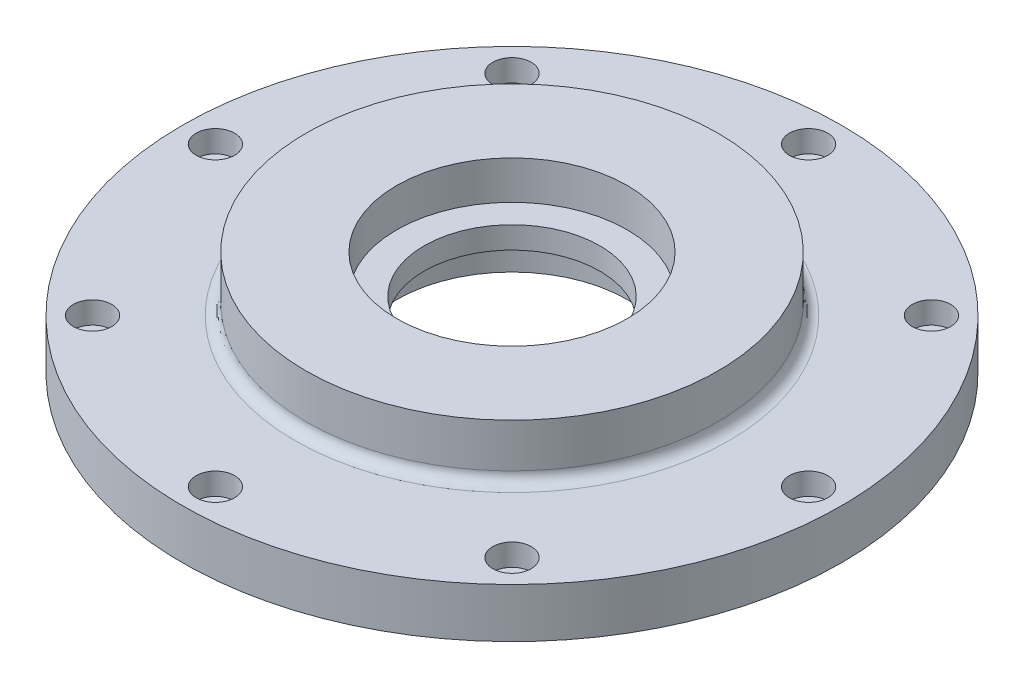
ISO-10303-21;
HEADER;
FILE_DESCRIPTION(('STEP AP214'),'2;1');
FILE_NAME('part.step','',(''),(''),'','','');
FILE_SCHEMA(('AUTOMOTIVE_DESIGN { 1 0 10303 214 1 1 1 1 }'));
ENDSEC;
DATA;
#1=APPLICATION_CONTEXT('core data for automotive mechanical design processes');
#2=APPLICATION_PROTOCOL_DEFINITION('international standard','automotive_design',2000,#1);
#3=PRODUCT_CONTEXT('',#1,'mechanical');
#4=PRODUCT('Part','Part','',(#3));
#5=PRODUCT_RELATED_PRODUCT_CATEGORY('part','',(#4));
#6=PRODUCT_DEFINITION_FORMATION('','',#4);
#7=PRODUCT_DEFINITION_CONTEXT('part definition',#1,'design');
#8=PRODUCT_DEFINITION('design','',#6,#7);
#9=PRODUCT_DEFINITION_SHAPE('','',#8);
#10=(LENGTH_UNIT() NAMED_UNIT(*) SI_UNIT(.MILLI.,.METRE.));
#11=(NAMED_UNIT(*) PLANE_ANGLE_UNIT() SI_UNIT($,.RADIAN.));
#12=(NAMED_UNIT(*) SI_UNIT($,.STERADIAN.) SOLID_ANGLE_UNIT());
#13=UNCERTAINTY_MEASURE_WITH_UNIT(LENGTH_MEASURE(1.E-05),#10,'distance_accuracy_value','');
#14=(GEOMETRIC_REPRESENTATION_CONTEXT(3) GLOBAL_UNCERTAINTY_ASSIGNED_CONTEXT((#13)) GLOBAL_UNIT_ASSIGNED_CONTEXT((#10,
#11,#12)) REPRESENTATION_CONTEXT('',''));
#15=CARTESIAN_POINT('',(0.,0.,0.));
#16=DIRECTION('',(0.,0.,1.));
#17=DIRECTION('',(1.,0.,0.));
#18=AXIS2_PLACEMENT_3D('',#15,#16,#17);
#19=CARTESIAN_POINT('',(-38.183766184073,-9.,-38.1837661840719));
#20=DIRECTION('',(0.,1.,0.));
#21=DIRECTION('',(0.,0.,1.));
#22=AXIS2_PLACEMENT_3D('',#19,#20,#21);
#23=CYLINDRICAL_SURFACE('',#22,2.);
#24=CARTESIAN_POINT('',(-38.183766184073,-8.,-38.1837661840719));
#25=DIRECTION('',(0.,-1.,0.));
#26=DIRECTION('',(1.,0.,0.));
#27=AXIS2_PLACEMENT_3D('',#24,#25,#26);
#28=CIRCLE('',#27,2.);
#29=CARTESIAN_POINT('',(-36.183766184073,-8.,-38.1837661840719));
#30=VERTEX_POINT('',#29);
#31=EDGE_CURVE('E53',#30,#30,#28,.T.);
#32=ORIENTED_EDGE('',*,*,#31,.T.);
#33=EDGE_LOOP('',(#32));
#34=FACE_BOUND('',#33,.T.);
#35=CARTESIAN_POINT('',(-38.183766184073,-3.,-38.1837661840719));
#36=DIRECTION('',(0.,1.,0.));
#37=DIRECTION('',(0.,0.,1.));
#38=AXIS2_PLACEMENT_3D('',#35,#36,#37);
#39=CIRCLE('',#38,2.);
#40=CARTESIAN_POINT('',(-38.183766184073,-3.,-36.1837661840719));
#41=VERTEX_POINT('',#40);
#42=EDGE_CURVE('E50',#41,#41,#39,.F.);
#43=ORIENTED_EDGE('',*,*,#42,.F.);
#44=EDGE_LOOP('',(#43));
#45=FACE_BOUND('',#44,.T.);
#46=ADVANCED_FACE('F32',(#34,#45),#23,.F.);
#47=CARTESIAN_POINT('',(-53.9999999999978,-9.,2.29885191750503E-12));
#48=DIRECTION('',(0.,1.,0.));
#49=DIRECTION('',(0.,0.,1.));
#50=AXIS2_PLACEMENT_3D('',#47,#48,#49);
#51=CYLINDRICAL_SURFACE('',#50,2.);
#52=CARTESIAN_POINT('',(-53.9999999999978,-8.,2.29885191750503E-12));
#53=DIRECTION('',(0.,-1.,0.));
#54=DIRECTION('',(1.,0.,0.));
#55=AXIS2_PLACEMENT_3D('',#52,#53,#54);
#56=CIRCLE('',#55,2.);
#57=CARTESIAN_POINT('',(-51.9999999999978,-8.,2.29885191750503E-12));
#58=VERTEX_POINT('',#57);
#59=EDGE_CURVE('E123',#58,#58,#56,.T.);
#60=ORIENTED_EDGE('',*,*,#59,.T.);
#61=EDGE_LOOP('',(#60));
#62=FACE_BOUND('',#61,.T.);
#63=CARTESIAN_POINT('',(-53.9999999999978,-3.,2.29885191750503E-12));
#64=DIRECTION('',(0.,1.,0.));
#65=DIRECTION('',(0.,0.,1.));
#66=AXIS2_PLACEMENT_3D('',#63,#64,#65);
#67=CIRCLE('',#66,2.);
#68=CARTESIAN_POINT('',(-53.9999999999978,-3.,2.0000000000023));
#69=VERTEX_POINT('',#68);
#70=EDGE_CURVE('E54',#69,#69,#67,.F.);
#71=ORIENTED_EDGE('',*,*,#70,.F.);
#72=EDGE_LOOP('',(#71));
#73=FACE_BOUND('',#72,.T.);
#74=ADVANCED_FACE('F230',(#62,#73),#51,.F.);
#75=CARTESIAN_POINT('',(-38.1837661840698,-9.,38.1837661840752));
#76=DIRECTION('',(0.,1.,0.));
#77=DIRECTION('',(0.,0.,1.));
#78=AXIS2_PLACEMENT_3D('',#75,#76,#77);
#79=CYLINDRICAL_SURFACE('',#78,2.);
#80=CARTESIAN_POINT('',(-38.1837661840698,-8.,38.1837661840752));
#81=DIRECTION('',(0.,-1.,0.));
#82=DIRECTION('',(1.,0.,0.));
#83=AXIS2_PLACEMENT_3D('',#80,#81,#82);
#84=CIRCLE('',#83,2.);
#85=CARTESIAN_POINT('',(-36.1837661840698,-8.,38.1837661840752));
#86=VERTEX_POINT('',#85);
#87=EDGE_CURVE('E120',#86,#86,#84,.T.);
#88=ORIENTED_EDGE('',*,*,#87,.T.);
#89=EDGE_LOOP('',(#88));
#90=FACE_BOUND('',#89,.T.);
#91=CARTESIAN_POINT('',(-38.1837661840698,-3.,38.1837661840752));
#92=DIRECTION('',(0.,1.,0.));
#93=DIRECTION('',(0.,0.,1.));
#94=AXIS2_PLACEMENT_3D('',#91,#92,#93);
#95=CIRCLE('',#94,2.);
#96=CARTESIAN_POINT('',(-38.1837661840698,-3.,40.1837661840752));
#97=VERTEX_POINT('',#96);
#98=EDGE_CURVE('E57',#97,#97,#95,.F.);
#99=ORIENTED_EDGE('',*,*,#98,.F.);
#100=EDGE_LOOP('',(#99));
#101=FACE_BOUND('',#100,.T.);
#102=ADVANCED_FACE('F236',(#90,#101),#79,.F.);
#103=CARTESIAN_POINT('',(4.48448403878421E-12,-9.,54.));
#104=DIRECTION('',(0.,1.,0.));
#105=DIRECTION('',(0.,0.,1.));
#106=AXIS2_PLACEMENT_3D('',#103,#104,#105);
#107=CYLINDRICAL_SURFACE('',#106,2.);
#108=CARTESIAN_POINT('',(4.48448403878421E-12,-8.,54.));
#109=DIRECTION('',(0.,-1.,0.));
#110=DIRECTION('',(1.,0.,0.));
#111=AXIS2_PLACEMENT_3D('',#108,#109,#110);
#112=CIRCLE('',#111,2.);
#113=CARTESIAN_POINT('',(2.00000000000449,-8.,54.));
#114=VERTEX_POINT('',#113);
#115=EDGE_CURVE('E117',#114,#114,#112,.T.);
#116=ORIENTED_EDGE('',*,*,#115,.T.);
#117=EDGE_LOOP('',(#116));
#118=FACE_BOUND('',#117,.T.);
#119=CARTESIAN_POINT('',(4.48448403878421E-12,-3.,54.));
#120=DIRECTION('',(0.,1.,0.));
#121=DIRECTION('',(0.,0.,1.));
#122=AXIS2_PLACEMENT_3D('',#119,#120,#121);
#123=CIRCLE('',#122,2.);
#124=CARTESIAN_POINT('',(4.48448403878421E-12,-3.,56.));
#125=VERTEX_POINT('',#124);
#126=EDGE_CURVE('E60',#125,#125,#123,.F.);
#127=ORIENTED_EDGE('',*,*,#126,.F.);
#128=EDGE_LOOP('',(#127));
#129=FACE_BOUND('',#128,.T.);
#130=ADVANCED_FACE('F297',(#118,#129),#107,.F.);
#131=CARTESIAN_POINT('',(38.1837661840774,-9.,38.1837661840719));
#132=DIRECTION('',(0.,1.,0.));
#133=DIRECTION('',(0.,0.,1.));
#134=AXIS2_PLACEMENT_3D('',#131,#132,#133);
#135=CYLINDRICAL_SURFACE('',#134,2.);
#136=CARTESIAN_POINT('',(38.1837661840774,-8.,38.1837661840719));
#137=DIRECTION('',(0.,-1.,0.));
#138=DIRECTION('',(1.,0.,0.));
#139=AXIS2_PLACEMENT_3D('',#136,#137,#138);
#140=CIRCLE('',#139,2.);
#141=CARTESIAN_POINT('',(40.1837661840774,-8.,38.1837661840719));
#142=VERTEX_POINT('',#141);
#143=EDGE_CURVE('E114',#142,#142,#140,.T.);
#144=ORIENTED_EDGE('',*,*,#143,.T.);
#145=EDGE_LOOP('',(#144));
#146=FACE_BOUND('',#145,.T.);
#147=CARTESIAN_POINT('',(38.1837661840774,-3.,38.1837661840719));
#148=DIRECTION('',(0.,1.,0.));
#149=DIRECTION('',(0.,0.,1.));
#150=AXIS2_PLACEMENT_3D('',#147,#148,#149);
#151=CIRCLE('',#150,2.);
#152=CARTESIAN_POINT('',(38.1837661840774,-3.,40.1837661840719));
#153=VERTEX_POINT('',#152);
#154=EDGE_CURVE('E63',#153,#153,#151,.F.);
#155=ORIENTED_EDGE('',*,*,#154,.F.);
#156=EDGE_LOOP('',(#155));
#157=FACE_BOUND('',#156,.T.);
#158=ADVANCED_FACE('F293',(#146,#157),#135,.F.);
#159=CARTESIAN_POINT('',(54.0000000000022,-9.,-2.29223882478963E-12));
#160=DIRECTION('',(0.,1.,0.));
#161=DIRECTION('',(0.,0.,1.));
#162=AXIS2_PLACEMENT_3D('',#159,#160,#161);
#163=CYLINDRICAL_SURFACE('',#162,2.);
#164=CARTESIAN_POINT('',(54.0000000000022,-8.,-2.29223882478963E-12));
#165=DIRECTION('',(0.,-1.,0.));
#166=DIRECTION('',(1.,0.,0.));
#167=AXIS2_PLACEMENT_3D('',#164,#165,#166);
#168=CIRCLE('',#167,2.);
#169=CARTESIAN_POINT('',(56.0000000000022,-8.,-2.29223882478963E-12));
#170=VERTEX_POINT('',#169);
#171=EDGE_CURVE('E111',#170,#170,#168,.T.);
#172=ORIENTED_EDGE('',*,*,#171,.T.);
#173=EDGE_LOOP('',(#172));
#174=FACE_BOUND('',#173,.T.);
#175=CARTESIAN_POINT('',(54.0000000000022,-3.,-2.29223882478963E-12));
#176=DIRECTION('',(0.,1.,0.));
#177=DIRECTION('',(0.,0.,1.));
#178=AXIS2_PLACEMENT_3D('',#175,#176,#177);
#179=CIRCLE('',#178,2.);
#180=CARTESIAN_POINT('',(54.0000000000022,-3.,1.99999999999771));
#181=VERTEX_POINT('',#180);
#182=EDGE_CURVE('E66',#181,#181,#179,.F.);
#183=ORIENTED_EDGE('',*,*,#182,.F.);
#184=EDGE_LOOP('',(#183));
#185=FACE_BOUND('',#184,.T.);
#186=ADVANCED_FACE('F283',(#174,#185),#163,.F.);
#187=CARTESIAN_POINT('',(38.1837661840741,-9.,-38.1837661840752));
#188=DIRECTION('',(0.,1.,0.));
#189=DIRECTION('',(0.,0.,1.));
#190=AXIS2_PLACEMENT_3D('',#187,#188,#189);
#191=CYLINDRICAL_SURFACE('',#190,2.);
#192=CARTESIAN_POINT('',(38.1837661840741,-8.,-38.1837661840752));
#193=DIRECTION('',(0.,-1.,0.));
#194=DIRECTION('',(1.,0.,0.));
#195=AXIS2_PLACEMENT_3D('',#192,#193,#194);
#196=CIRCLE('',#195,2.);
#197=CARTESIAN_POINT('',(40.1837661840741,-8.,-38.1837661840752));
#198=VERTEX_POINT('',#197);
#199=EDGE_CURVE('E108',#198,#198,#196,.T.);
#200=ORIENTED_EDGE('',*,*,#199,.T.);
#201=EDGE_LOOP('',(#200));
#202=FACE_BOUND('',#201,.T.);
#203=CARTESIAN_POINT('',(38.1837661840741,-3.,-38.1837661840752));
#204=DIRECTION('',(0.,1.,0.));
#205=DIRECTION('',(0.,0.,1.));
#206=AXIS2_PLACEMENT_3D('',#203,#204,#205);
#207=CIRCLE('',#206,2.);
#208=CARTESIAN_POINT('',(38.1837661840741,-3.,-36.1837661840752));
#209=VERTEX_POINT('',#208);
#210=EDGE_CURVE('E69',#209,#209,#207,.F.);
#211=ORIENTED_EDGE('',*,*,#210,.F.);
#212=EDGE_LOOP('',(#211));
#213=FACE_BOUND('',#212,.T.);
#214=ADVANCED_FACE('F268',(#202,#213),#191,.F.);
#215=CARTESIAN_POINT('',(0.,-9.,-54.));
#216=DIRECTION('',(0.,1.,0.));
#217=DIRECTION('',(0.,0.,1.));
#218=AXIS2_PLACEMENT_3D('',#215,#216,#217);
#219=CYLINDRICAL_SURFACE('',#218,2.);
#220=CARTESIAN_POINT('',(0.,-8.,-54.));
#221=DIRECTION('',(0.,-1.,0.));
#222=DIRECTION('',(1.,0.,0.));
#223=AXIS2_PLACEMENT_3D('',#220,#221,#222);
#224=CIRCLE('',#223,2.);
#225=CARTESIAN_POINT('',(1.9999999999999,-8.,-54.));
#226=VERTEX_POINT('',#225);
#227=EDGE_CURVE('E103',#226,#226,#224,.T.);
#228=ORIENTED_EDGE('',*,*,#227,.T.);
#229=EDGE_LOOP('',(#228));
#230=FACE_BOUND('',#229,.T.);
#231=CARTESIAN_POINT('',(0.,-3.,-54.));
#232=DIRECTION('',(0.,1.,0.));
#233=DIRECTION('',(0.,0.,1.));
#234=AXIS2_PLACEMENT_3D('',#231,#232,#233);
#235=CIRCLE('',#234,2.);
#236=CARTESIAN_POINT('',(0.,-3.,-52.));
#237=VERTEX_POINT('',#236);
#238=EDGE_CURVE('E72',#237,#237,#235,.F.);
#239=ORIENTED_EDGE('',*,*,#238,.F.);
#240=EDGE_LOOP('',(#239));
#241=FACE_BOUND('',#240,.T.);
#242=ADVANCED_FACE('F260',(#230,#241),#219,.F.);
#243=CARTESIAN_POINT('',(0.,11.,0.));
#244=DIRECTION('',(0.,1.,0.));
#245=DIRECTION('',(-1.,0.,0.));
#246=AXIS2_PLACEMENT_3D('',#243,#244,#245);
#247=CYLINDRICAL_SURFACE('',#246,21.);
#248=CARTESIAN_POINT('',(0.,0.,0.));
#249=DIRECTION('',(0.,1.,0.));
#250=DIRECTION('',(-1.,0.,0.));
#251=AXIS2_PLACEMENT_3D('',#248,#249,#250);
#252=CIRCLE('',#251,21.);
#253=CARTESIAN_POINT('',(-21.,0.,0.));
#254=VERTEX_POINT('',#253);
#255=EDGE_CURVE('E87',#254,#254,#252,.T.);
#256=ORIENTED_EDGE('',*,*,#255,.T.);
#257=EDGE_LOOP('',(#256));
#258=FACE_BOUND('',#257,.T.);
#259=CARTESIAN_POINT('',(0.,-7.,0.));
#260=DIRECTION('',(0.,-1.,0.));
#261=DIRECTION('',(0.,0.,-1.));
#262=AXIS2_PLACEMENT_3D('',#259,#260,#261);
#263=CIRCLE('',#262,21.);
#264=CARTESIAN_POINT('',(0.,-7.,-21.));
#265=VERTEX_POINT('',#264);
#266=EDGE_CURVE('E76',#265,#265,#263,.T.);
#267=ORIENTED_EDGE('',*,*,#266,.T.);
#268=EDGE_LOOP('',(#267));
#269=FACE_BOUND('',#268,.T.);
#270=ADVANCED_FACE('F257',(#258,#269),#247,.F.);
#271=CARTESIAN_POINT('',(-21.,11.,0.));
#272=DIRECTION('',(0.,1.,0.));
#273=DIRECTION('',(-1.,0.,0.));
#274=AXIS2_PLACEMENT_3D('',#271,#272,#273);
#275=PLANE('',#274);
#276=CARTESIAN_POINT('',(0.,11.,0.));
#277=DIRECTION('',(0.,1.,0.));
#278=DIRECTION('',(-1.,0.,0.));
#279=AXIS2_PLACEMENT_3D('',#276,#277,#278);
#280=CIRCLE('',#279,21.);
#281=CARTESIAN_POINT('',(-21.,11.,0.));
#282=VERTEX_POINT('',#281);
#283=EDGE_CURVE('E43',#282,#282,#280,.T.);
#284=ORIENTED_EDGE('',*,*,#283,.F.);
#285=EDGE_LOOP('',(#284));
#286=FACE_BOUND('',#285,.T.);
#287=CARTESIAN_POINT('',(0.,11.,0.));
#288=DIRECTION('',(0.,-1.,0.));
#289=DIRECTION('',(0.,0.,-1.));
#290=AXIS2_PLACEMENT_3D('',#287,#288,#289);
#291=CIRCLE('',#290,37.5);
#292=CARTESIAN_POINT('',(0.,11.,-37.5));
#293=VERTEX_POINT('',#292);
#294=EDGE_CURVE('E79',#293,#293,#291,.T.);
#295=ORIENTED_EDGE('',*,*,#294,.F.);
#296=EDGE_LOOP('',(#295));
#297=FACE_BOUND('',#296,.T.);
#298=ADVANCED_FACE('F259',(#286,#297),#275,.T.);
#299=CARTESIAN_POINT('',(0.,11.,0.));
#300=DIRECTION('',(0.,1.,0.));
#301=DIRECTION('',(-1.,0.,0.));
#302=AXIS2_PLACEMENT_3D('',#299,#300,#301);
#303=CYLINDRICAL_SURFACE('',#302,21.);
#304=ORIENTED_EDGE('',*,*,#283,.T.);
#305=EDGE_LOOP('',(#304));
#306=FACE_BOUND('',#305,.T.);
#307=CARTESIAN_POINT('',(0.,4.00000000000001,0.));
#308=DIRECTION('',(0.,1.,0.));
#309=DIRECTION('',(-1.,0.,0.));
#310=AXIS2_PLACEMENT_3D('',#307,#308,#309);
#311=CIRCLE('',#310,21.);
#312=CARTESIAN_POINT('',(-21.,4.00000000000001,0.));
#313=VERTEX_POINT('',#312);
#314=EDGE_CURVE('E83',#313,#313,#311,.T.);
#315=ORIENTED_EDGE('',*,*,#314,.F.);
#316=EDGE_LOOP('',(#315));
#317=FACE_BOUND('',#316,.T.);
#318=ADVANCED_FACE('F212',(#306,#317),#303,.F.);
#319=CARTESIAN_POINT('',(0.,11.,0.));
#320=DIRECTION('',(0.,1.,0.));
#321=DIRECTION('',(-1.,0.,0.));
#322=AXIS2_PLACEMENT_3D('',#319,#320,#321);
#323=CYLINDRICAL_SURFACE('',#322,60.);
#324=CARTESIAN_POINT('',(0.,1.,0.));
#325=DIRECTION('',(0.,-1.,0.));
#326=DIRECTION('',(0.,0.,-1.));
#327=AXIS2_PLACEMENT_3D('',#324,#325,#326);
#328=CIRCLE('',#327,60.);
#329=CARTESIAN_POINT('',(0.,1.,-60.));
#330=VERTEX_POINT('',#329);
#331=EDGE_CURVE('E81',#330,#330,#328,.F.);
#332=ORIENTED_EDGE('',*,*,#331,.F.);
#333=EDGE_LOOP('',(#332));
#334=FACE_BOUND('',#333,.T.);
#335=CARTESIAN_POINT('',(0.,-8.,0.));
#336=DIRECTION('',(0.,1.,0.));
#337=DIRECTION('',(-1.,0.,0.));
#338=AXIS2_PLACEMENT_3D('',#335,#336,#337);
#339=CIRCLE('',#338,60.);
#340=CARTESIAN_POINT('',(-60.,-8.,0.));
#341=VERTEX_POINT('',#340);
#342=EDGE_CURVE('E47',#341,#341,#339,.T.);
#343=ORIENTED_EDGE('',*,*,#342,.T.);
#344=EDGE_LOOP('',(#343));
#345=FACE_BOUND('',#344,.T.);
#346=ADVANCED_FACE('F208',(#334,#345),#323,.T.);
#347=CARTESIAN_POINT('',(-60.,-8.,0.));
#348=DIRECTION('',(0.,-1.,0.));
#349=DIRECTION('',(1.,0.,0.));
#350=AXIS2_PLACEMENT_3D('',#347,#348,#349);
#351=PLANE('',#350);
#352=ORIENTED_EDGE('',*,*,#227,.F.);
#353=EDGE_LOOP('',(#352));
#354=FACE_BOUND('',#353,.T.);
#355=ORIENTED_EDGE('',*,*,#199,.F.);
#356=EDGE_LOOP('',(#355));
#357=FACE_BOUND('',#356,.T.);
#358=ORIENTED_EDGE('',*,*,#171,.F.);
#359=EDGE_LOOP('',(#358));
#360=FACE_BOUND('',#359,.T.);
#361=ORIENTED_EDGE('',*,*,#143,.F.);
#362=EDGE_LOOP('',(#361));
#363=FACE_BOUND('',#362,.T.);
#364=ORIENTED_EDGE('',*,*,#115,.F.);
#365=EDGE_LOOP('',(#364));
#366=FACE_BOUND('',#365,.T.);
#367=ORIENTED_EDGE('',*,*,#87,.F.);
#368=EDGE_LOOP('',(#367));
#369=FACE_BOUND('',#368,.T.);
#370=ORIENTED_EDGE('',*,*,#59,.F.);
#371=EDGE_LOOP('',(#370));
#372=FACE_BOUND('',#371,.T.);
#373=ORIENTED_EDGE('',*,*,#31,.F.);
#374=EDGE_LOOP('',(#373));
#375=FACE_BOUND('',#374,.T.);
#376=CARTESIAN_POINT('',(0.,-8.,0.));
#377=DIRECTION('',(0.,-1.,0.));
#378=DIRECTION('',(0.,0.,-1.));
#379=AXIS2_PLACEMENT_3D('',#376,#377,#378);
#380=CIRCLE('',#379,35.5);
#381=CARTESIAN_POINT('',(0.,-8.,-35.5));
#382=VERTEX_POINT('',#381);
#383=EDGE_CURVE('E100',#382,#382,#380,.T.);
#384=ORIENTED_EDGE('',*,*,#383,.F.);
#385=EDGE_LOOP('',(#384));
#386=FACE_BOUND('',#385,.T.);
#387=ORIENTED_EDGE('',*,*,#342,.F.);
#388=EDGE_LOOP('',(#387));
#389=FACE_BOUND('',#388,.T.);
#390=ADVANCED_FACE('F211',(#354,#357,#360,#363,#366,#369,#372,#375,#386,#389),#351,.T.);
#391=CARTESIAN_POINT('',(-21.,0.,0.));
#392=DIRECTION('',(0.,-1.,0.));
#393=DIRECTION('',(1.,0.,0.));
#394=AXIS2_PLACEMENT_3D('',#391,#392,#393);
#395=PLANE('',#394);
#396=CARTESIAN_POINT('',(0.,0.,0.));
#397=DIRECTION('',(0.,1.,0.));
#398=DIRECTION('',(-1.,0.,0.));
#399=AXIS2_PLACEMENT_3D('',#396,#397,#398);
#400=CIRCLE('',#399,16.);
#401=CARTESIAN_POINT('',(-16.,0.,0.));
#402=VERTEX_POINT('',#401);
#403=EDGE_CURVE('E90',#402,#402,#400,.T.);
#404=ORIENTED_EDGE('',*,*,#403,.T.);
#405=EDGE_LOOP('',(#404));
#406=FACE_BOUND('',#405,.T.);
#407=ORIENTED_EDGE('',*,*,#255,.F.);
#408=EDGE_LOOP('',(#407));
#409=FACE_BOUND('',#408,.T.);
#410=ADVANCED_FACE('F217',(#406,#409),#395,.T.);
#411=CARTESIAN_POINT('',(0.,11.,0.));
#412=DIRECTION('',(0.,1.,0.));
#413=DIRECTION('',(-1.,0.,0.));
#414=AXIS2_PLACEMENT_3D('',#411,#412,#413);
#415=CYLINDRICAL_SURFACE('',#414,16.);
#416=CARTESIAN_POINT('',(0.,4.00000000000001,0.));
#417=DIRECTION('',(0.,1.,0.));
#418=DIRECTION('',(-1.,0.,0.));
#419=AXIS2_PLACEMENT_3D('',#416,#417,#418);
#420=CIRCLE('',#419,16.);
#421=CARTESIAN_POINT('',(-16.,4.00000000000001,0.));
#422=VERTEX_POINT('',#421);
#423=EDGE_CURVE('E93',#422,#422,#420,.T.);
#424=ORIENTED_EDGE('',*,*,#423,.T.);
#425=EDGE_LOOP('',(#424));
#426=FACE_BOUND('',#425,.T.);
#427=ORIENTED_EDGE('',*,*,#403,.F.);
#428=EDGE_LOOP('',(#427));
#429=FACE_BOUND('',#428,.T.);
#430=ADVANCED_FACE('F223',(#426,#429),#415,.F.);
#431=CARTESIAN_POINT('',(-16.,4.00000000000001,0.));
#432=DIRECTION('',(0.,1.,0.));
#433=DIRECTION('',(-1.,0.,0.));
#434=AXIS2_PLACEMENT_3D('',#431,#432,#433);
#435=PLANE('',#434);
#436=ORIENTED_EDGE('',*,*,#314,.T.);
#437=EDGE_LOOP('',(#436));
#438=FACE_BOUND('',#437,.T.);
#439=ORIENTED_EDGE('',*,*,#423,.F.);
#440=EDGE_LOOP('',(#439));
#441=FACE_BOUND('',#440,.T.);
#442=ADVANCED_FACE('F190',(#438,#441),#435,.T.);
#443=CARTESIAN_POINT('',(0.,1.,0.));
#444=DIRECTION('',(0.,-1.,0.));
#445=DIRECTION('',(0.,0.,-1.));
#446=AXIS2_PLACEMENT_3D('',#443,#444,#445);
#447=PLANE('',#446);
#448=CARTESIAN_POINT('',(0.,1.,0.));
#449=DIRECTION('',(0.,-1.,0.));
#450=DIRECTION('',(0.,0.,-1.));
#451=AXIS2_PLACEMENT_3D('',#448,#449,#450);
#452=CIRCLE('',#451,39.5);
#453=CARTESIAN_POINT('',(0.,1.,-39.5));
#454=VERTEX_POINT('',#453);
#455=EDGE_CURVE('E39',#454,#454,#452,.T.);
#456=ORIENTED_EDGE('',*,*,#455,.T.);
#457=EDGE_LOOP('',(#456));
#458=FACE_BOUND('',#457,.T.);
#459=CARTESIAN_POINT('',(0.,1.,-54.));
#460=DIRECTION('',(0.,1.,0.));
#461=DIRECTION('',(0.,0.,1.));
#462=AXIS2_PLACEMENT_3D('',#459,#460,#461);
#463=CIRCLE('',#462,3.5);
#464=CARTESIAN_POINT('',(0.,1.,-50.5));
#465=VERTEX_POINT('',#464);
#466=EDGE_CURVE('E170',#465,#465,#463,.T.);
#467=ORIENTED_EDGE('',*,*,#466,.F.);
#468=EDGE_LOOP('',(#467));
#469=FACE_BOUND('',#468,.T.);
#470=CARTESIAN_POINT('',(38.1837661840742,1.,-38.1837661840753));
#471=DIRECTION('',(0.,1.,0.));
#472=DIRECTION('',(0.,0.,1.));
#473=AXIS2_PLACEMENT_3D('',#470,#471,#472);
#474=CIRCLE('',#473,3.50000000000026);
#475=CARTESIAN_POINT('',(38.1837661840742,1.,-34.683766184075));
#476=VERTEX_POINT('',#475);
#477=EDGE_CURVE('E164',#476,#476,#474,.T.);
#478=ORIENTED_EDGE('',*,*,#477,.F.);
#479=EDGE_LOOP('',(#478));
#480=FACE_BOUND('',#479,.T.);
#481=CARTESIAN_POINT('',(54.0000000000023,1.,-2.38816209411724E-12));
#482=DIRECTION('',(0.,1.,0.));
#483=DIRECTION('',(0.,0.,1.));
#484=AXIS2_PLACEMENT_3D('',#481,#482,#483);
#485=CIRCLE('',#484,3.5000000000017);
#486=CARTESIAN_POINT('',(54.0000000000023,1.,3.49999999999931));
#487=VERTEX_POINT('',#486);
#488=EDGE_CURVE('E158',#487,#487,#485,.T.);
#489=ORIENTED_EDGE('',*,*,#488,.F.);
#490=EDGE_LOOP('',(#489));
#491=FACE_BOUND('',#490,.T.);
#492=CARTESIAN_POINT('',(38.1837661840775,1.,38.1837661840719));
#493=DIRECTION('',(0.,1.,0.));
#494=DIRECTION('',(0.,0.,1.));
#495=AXIS2_PLACEMENT_3D('',#492,#493,#494);
#496=CIRCLE('',#495,3.50000000000352);
#497=CARTESIAN_POINT('',(38.1837661840775,1.,41.6837661840754));
#498=VERTEX_POINT('',#497);
#499=EDGE_CURVE('E152',#498,#498,#496,.T.);
#500=ORIENTED_EDGE('',*,*,#499,.F.);
#501=EDGE_LOOP('',(#500));
#502=FACE_BOUND('',#501,.T.);
#503=CARTESIAN_POINT('',(4.67633057743943E-12,1.,54.));
#504=DIRECTION('',(0.,1.,0.));
#505=DIRECTION('',(0.,0.,1.));
#506=AXIS2_PLACEMENT_3D('',#503,#504,#505);
#507=CIRCLE('',#506,3.50000000000474);
#508=CARTESIAN_POINT('',(4.67633057743943E-12,1.,57.5000000000047));
#509=VERTEX_POINT('',#508);
#510=EDGE_CURVE('E146',#509,#509,#507,.T.);
#511=ORIENTED_EDGE('',*,*,#510,.F.);
#512=EDGE_LOOP('',(#511));
#513=FACE_BOUND('',#512,.T.);
#514=CARTESIAN_POINT('',(-38.1837661840696,1.,38.1837661840753));
#515=DIRECTION('',(0.,1.,0.));
#516=DIRECTION('',(0.,0.,1.));
#517=AXIS2_PLACEMENT_3D('',#514,#515,#516);
#518=CIRCLE('',#517,3.50000000000465);
#519=CARTESIAN_POINT('',(-38.1837661840696,1.,41.6837661840799));
#520=VERTEX_POINT('',#519);
#521=EDGE_CURVE('E140',#520,#520,#518,.T.);
#522=ORIENTED_EDGE('',*,*,#521,.F.);
#523=EDGE_LOOP('',(#522));
#524=FACE_BOUND('',#523,.T.);
#525=CARTESIAN_POINT('',(-53.9999999999977,1.,2.39477518683264E-12));
#526=DIRECTION('',(0.,1.,0.));
#527=DIRECTION('',(0.,0.,1.));
#528=AXIS2_PLACEMENT_3D('',#525,#526,#527);
#529=CIRCLE('',#528,3.5000000000034);
#530=CARTESIAN_POINT('',(-53.9999999999977,1.,3.50000000000579));
#531=VERTEX_POINT('',#530);
#532=EDGE_CURVE('E134',#531,#531,#529,.T.);
#533=ORIENTED_EDGE('',*,*,#532,.F.);
#534=EDGE_LOOP('',(#533));
#535=FACE_BOUND('',#534,.T.);
#536=CARTESIAN_POINT('',(-38.183766184073,1.,-38.1837661840719));
#537=DIRECTION('',(0.,1.,0.));
#538=DIRECTION('',(0.,0.,1.));
#539=AXIS2_PLACEMENT_3D('',#536,#537,#538);
#540=CIRCLE('',#539,3.50000000000175);
#541=CARTESIAN_POINT('',(-38.183766184073,1.,-34.6837661840701));
#542=VERTEX_POINT('',#541);
#543=EDGE_CURVE('E128',#542,#542,#540,.T.);
#544=ORIENTED_EDGE('',*,*,#543,.F.);
#545=EDGE_LOOP('',(#544));
#546=FACE_BOUND('',#545,.T.);
#547=ORIENTED_EDGE('',*,*,#331,.T.);
#548=EDGE_LOOP('',(#547));
#549=FACE_BOUND('',#548,.T.);
#550=ADVANCED_FACE('F186',(#458,#469,#480,#491,#502,#513,#524,#535,#546,#549),#447,.F.);
#551=CARTESIAN_POINT('',(0.,1.,0.));
#552=DIRECTION('',(0.,1.,0.));
#553=DIRECTION('',(0.,0.,1.));
#554=AXIS2_PLACEMENT_3D('',#551,#552,#553);
#555=CYLINDRICAL_SURFACE('',#554,37.5);
#556=CARTESIAN_POINT('',(0.,3.,0.));
#557=DIRECTION('',(0.,-1.,0.));
#558=DIRECTION('',(0.,0.,-1.));
#559=AXIS2_PLACEMENT_3D('',#556,#557,#558);
#560=CIRCLE('',#559,37.5);
#561=CARTESIAN_POINT('',(0.,3.,-37.5));
#562=VERTEX_POINT('',#561);
#563=EDGE_CURVE('E10',#562,#562,#560,.F.);
#564=ORIENTED_EDGE('',*,*,#563,.T.);
#565=EDGE_LOOP('',(#564));
#566=FACE_BOUND('',#565,.T.);
#567=ORIENTED_EDGE('',*,*,#294,.T.);
#568=EDGE_LOOP('',(#567));
#569=FACE_BOUND('',#568,.T.);
#570=ADVANCED_FACE('F189',(#566,#569),#555,.T.);
#571=CARTESIAN_POINT('',(0.,-7.,0.));
#572=DIRECTION('',(0.,-1.,0.));
#573=DIRECTION('',(0.,0.,-1.));
#574=AXIS2_PLACEMENT_3D('',#571,#572,#573);
#575=CYLINDRICAL_SURFACE('',#574,35.5);
#576=CARTESIAN_POINT('',(0.,-7.,0.));
#577=DIRECTION('',(0.,-1.,0.));
#578=DIRECTION('',(0.,0.,-1.));
#579=AXIS2_PLACEMENT_3D('',#576,#577,#578);
#580=CIRCLE('',#579,35.5);
#581=CARTESIAN_POINT('',(0.,-7.,-35.5));
#582=VERTEX_POINT('',#581);
#583=EDGE_CURVE('E80',#582,#582,#580,.T.);
#584=ORIENTED_EDGE('',*,*,#583,.F.);
#585=EDGE_LOOP('',(#584));
#586=FACE_BOUND('',#585,.T.);
#587=ORIENTED_EDGE('',*,*,#383,.T.);
#588=EDGE_LOOP('',(#587));
#589=FACE_BOUND('',#588,.T.);
#590=ADVANCED_FACE('F245',(#586,#589),#575,.F.);
#591=CARTESIAN_POINT('',(0.,-7.,0.));
#592=DIRECTION('',(0.,-1.,0.));
#593=DIRECTION('',(0.,0.,-1.));
#594=AXIS2_PLACEMENT_3D('',#591,#592,#593);
#595=PLANE('',#594);
#596=ORIENTED_EDGE('',*,*,#266,.F.);
#597=EDGE_LOOP('',(#596));
#598=FACE_BOUND('',#597,.T.);
#599=ORIENTED_EDGE('',*,*,#583,.T.);
#600=EDGE_LOOP('',(#599));
#601=FACE_BOUND('',#600,.T.);
#602=ADVANCED_FACE('F242',(#598,#601),#595,.T.);
#603=CARTESIAN_POINT('',(0.,-3.,-54.));
#604=DIRECTION('',(0.,1.,0.));
#605=DIRECTION('',(0.,0.,1.));
#606=AXIS2_PLACEMENT_3D('',#603,#604,#605);
#607=PLANE('',#606);
#608=CARTESIAN_POINT('',(0.,-3.,-54.));
#609=DIRECTION('',(0.,1.,0.));
#610=DIRECTION('',(0.,0.,1.));
#611=AXIS2_PLACEMENT_3D('',#608,#609,#610);
#612=CIRCLE('',#611,3.5);
#613=CARTESIAN_POINT('',(0.,-3.,-50.5));
#614=VERTEX_POINT('',#613);
#615=EDGE_CURVE('E75',#614,#614,#612,.T.);
#616=ORIENTED_EDGE('',*,*,#615,.T.);
#617=EDGE_LOOP('',(#616));
#618=FACE_BOUND('',#617,.T.);
#619=ORIENTED_EDGE('',*,*,#238,.T.);
#620=EDGE_LOOP('',(#619));
#621=FACE_BOUND('',#620,.T.);
#622=ADVANCED_FACE('F176',(#618,#621),#607,.T.);
#623=CARTESIAN_POINT('',(0.,-3.,-54.));
#624=DIRECTION('',(0.,1.,0.));
#625=DIRECTION('',(0.,0.,1.));
#626=AXIS2_PLACEMENT_3D('',#623,#624,#625);
#627=CYLINDRICAL_SURFACE('',#626,3.5);
#628=ORIENTED_EDGE('',*,*,#615,.F.);
#629=EDGE_LOOP('',(#628));
#630=FACE_BOUND('',#629,.T.);
#631=ORIENTED_EDGE('',*,*,#466,.T.);
#632=EDGE_LOOP('',(#631));
#633=FACE_BOUND('',#632,.T.);
#634=ADVANCED_FACE('F179',(#630,#633),#627,.F.);
#635=CARTESIAN_POINT('',(38.1837661840742,-3.,-38.1837661840753));
#636=DIRECTION('',(0.,1.,0.));
#637=DIRECTION('',(0.,0.,1.));
#638=AXIS2_PLACEMENT_3D('',#635,#636,#637);
#639=PLANE('',#638);
#640=CARTESIAN_POINT('',(38.1837661840742,-3.,-38.1837661840753));
#641=DIRECTION('',(0.,1.,0.));
#642=DIRECTION('',(0.,0.,1.));
#643=AXIS2_PLACEMENT_3D('',#640,#641,#642);
#644=CIRCLE('',#643,3.50000000000026);
#645=CARTESIAN_POINT('',(38.1837661840742,-3.,-34.683766184075));
#646=VERTEX_POINT('',#645);
#647=EDGE_CURVE('E167',#646,#646,#644,.T.);
#648=ORIENTED_EDGE('',*,*,#647,.T.);
#649=EDGE_LOOP('',(#648));
#650=FACE_BOUND('',#649,.T.);
#651=ORIENTED_EDGE('',*,*,#210,.T.);
#652=EDGE_LOOP('',(#651));
#653=FACE_BOUND('',#652,.T.);
#654=ADVANCED_FACE('F182',(#650,#653),#639,.T.);
#655=CARTESIAN_POINT('',(38.1837661840742,-3.,-38.1837661840753));
#656=DIRECTION('',(0.,1.,0.));
#657=DIRECTION('',(0.,0.,1.));
#658=AXIS2_PLACEMENT_3D('',#655,#656,#657);
#659=CYLINDRICAL_SURFACE('',#658,3.50000000000026);
#660=ORIENTED_EDGE('',*,*,#647,.F.);
#661=EDGE_LOOP('',(#660));
#662=FACE_BOUND('',#661,.T.);
#663=ORIENTED_EDGE('',*,*,#477,.T.);
#664=EDGE_LOOP('',(#663));
#665=FACE_BOUND('',#664,.T.);
#666=ADVANCED_FACE('F449',(#662,#665),#659,.F.);
#667=CARTESIAN_POINT('',(54.0000000000023,-3.,-2.38816209411724E-12));
#668=DIRECTION('',(0.,1.,0.));
#669=DIRECTION('',(0.,0.,1.));
#670=AXIS2_PLACEMENT_3D('',#667,#668,#669);
#671=PLANE('',#670);
#672=CARTESIAN_POINT('',(54.0000000000023,-3.,-2.38816209411724E-12));
#673=DIRECTION('',(0.,1.,0.));
#674=DIRECTION('',(0.,0.,1.));
#675=AXIS2_PLACEMENT_3D('',#672,#673,#674);
#676=CIRCLE('',#675,3.5000000000017);
#677=CARTESIAN_POINT('',(54.0000000000023,-3.,3.49999999999931));
#678=VERTEX_POINT('',#677);
#679=EDGE_CURVE('E161',#678,#678,#676,.T.);
#680=ORIENTED_EDGE('',*,*,#679,.T.);
#681=EDGE_LOOP('',(#680));
#682=FACE_BOUND('',#681,.T.);
#683=ORIENTED_EDGE('',*,*,#182,.T.);
#684=EDGE_LOOP('',(#683));
#685=FACE_BOUND('',#684,.T.);
#686=ADVANCED_FACE('F439',(#682,#685),#671,.T.);
#687=CARTESIAN_POINT('',(54.0000000000023,-3.,-2.38816209411724E-12));
#688=DIRECTION('',(0.,1.,0.));
#689=DIRECTION('',(0.,0.,1.));
#690=AXIS2_PLACEMENT_3D('',#687,#688,#689);
#691=CYLINDRICAL_SURFACE('',#690,3.5000000000017);
#692=ORIENTED_EDGE('',*,*,#679,.F.);
#693=EDGE_LOOP('',(#692));
#694=FACE_BOUND('',#693,.T.);
#695=ORIENTED_EDGE('',*,*,#488,.T.);
#696=EDGE_LOOP('',(#695));
#697=FACE_BOUND('',#696,.T.);
#698=ADVANCED_FACE('F429',(#694,#697),#691,.F.);
#699=CARTESIAN_POINT('',(38.1837661840775,-3.,38.1837661840719));
#700=DIRECTION('',(0.,1.,0.));
#701=DIRECTION('',(0.,0.,1.));
#702=AXIS2_PLACEMENT_3D('',#699,#700,#701);
#703=PLANE('',#702);
#704=CARTESIAN_POINT('',(38.1837661840775,-3.,38.1837661840719));
#705=DIRECTION('',(0.,1.,0.));
#706=DIRECTION('',(0.,0.,1.));
#707=AXIS2_PLACEMENT_3D('',#704,#705,#706);
#708=CIRCLE('',#707,3.50000000000352);
#709=CARTESIAN_POINT('',(38.1837661840775,-3.,41.6837661840754));
#710=VERTEX_POINT('',#709);
#711=EDGE_CURVE('E155',#710,#710,#708,.T.);
#712=ORIENTED_EDGE('',*,*,#711,.T.);
#713=EDGE_LOOP('',(#712));
#714=FACE_BOUND('',#713,.T.);
#715=ORIENTED_EDGE('',*,*,#154,.T.);
#716=EDGE_LOOP('',(#715));
#717=FACE_BOUND('',#716,.T.);
#718=ADVANCED_FACE('F419',(#714,#717),#703,.T.);
#719=CARTESIAN_POINT('',(38.1837661840775,-3.,38.1837661840719));
#720=DIRECTION('',(0.,1.,0.));
#721=DIRECTION('',(0.,0.,1.));
#722=AXIS2_PLACEMENT_3D('',#719,#720,#721);
#723=CYLINDRICAL_SURFACE('',#722,3.50000000000352);
#724=ORIENTED_EDGE('',*,*,#711,.F.);
#725=EDGE_LOOP('',(#724));
#726=FACE_BOUND('',#725,.T.);
#727=ORIENTED_EDGE('',*,*,#499,.T.);
#728=EDGE_LOOP('',(#727));
#729=FACE_BOUND('',#728,.T.);
#730=ADVANCED_FACE('F410',(#726,#729),#723,.F.);
#731=CARTESIAN_POINT('',(4.67633057743943E-12,-3.,54.));
#732=DIRECTION('',(0.,1.,0.));
#733=DIRECTION('',(0.,0.,1.));
#734=AXIS2_PLACEMENT_3D('',#731,#732,#733);
#735=PLANE('',#734);
#736=CARTESIAN_POINT('',(4.67633057743943E-12,-3.,54.));
#737=DIRECTION('',(0.,1.,0.));
#738=DIRECTION('',(0.,0.,1.));
#739=AXIS2_PLACEMENT_3D('',#736,#737,#738);
#740=CIRCLE('',#739,3.50000000000474);
#741=CARTESIAN_POINT('',(4.67633057743943E-12,-3.,57.5000000000047));
#742=VERTEX_POINT('',#741);
#743=EDGE_CURVE('E149',#742,#742,#740,.T.);
#744=ORIENTED_EDGE('',*,*,#743,.T.);
#745=EDGE_LOOP('',(#744));
#746=FACE_BOUND('',#745,.T.);
#747=ORIENTED_EDGE('',*,*,#126,.T.);
#748=EDGE_LOOP('',(#747));
#749=FACE_BOUND('',#748,.T.);
#750=ADVANCED_FACE('F322',(#746,#749),#735,.T.);
#751=CARTESIAN_POINT('',(4.67633057743943E-12,-3.,54.));
#752=DIRECTION('',(0.,1.,0.));
#753=DIRECTION('',(0.,0.,1.));
#754=AXIS2_PLACEMENT_3D('',#751,#752,#753);
#755=CYLINDRICAL_SURFACE('',#754,3.50000000000474);
#756=ORIENTED_EDGE('',*,*,#743,.F.);
#757=EDGE_LOOP('',(#756));
#758=FACE_BOUND('',#757,.T.);
#759=ORIENTED_EDGE('',*,*,#510,.T.);
#760=EDGE_LOOP('',(#759));
#761=FACE_BOUND('',#760,.T.);
#762=ADVANCED_FACE('F312',(#758,#761),#755,.F.);
#763=CARTESIAN_POINT('',(-38.1837661840696,-3.,38.1837661840753));
#764=DIRECTION('',(0.,1.,0.));
#765=DIRECTION('',(0.,0.,1.));
#766=AXIS2_PLACEMENT_3D('',#763,#764,#765);
#767=PLANE('',#766);
#768=CARTESIAN_POINT('',(-38.1837661840696,-3.,38.1837661840753));
#769=DIRECTION('',(0.,1.,0.));
#770=DIRECTION('',(0.,0.,1.));
#771=AXIS2_PLACEMENT_3D('',#768,#769,#770);
#772=CIRCLE('',#771,3.50000000000465);
#773=CARTESIAN_POINT('',(-38.1837661840696,-3.,41.6837661840799));
#774=VERTEX_POINT('',#773);
#775=EDGE_CURVE('E143',#774,#774,#772,.T.);
#776=ORIENTED_EDGE('',*,*,#775,.T.);
#777=EDGE_LOOP('',(#776));
#778=FACE_BOUND('',#777,.T.);
#779=ORIENTED_EDGE('',*,*,#98,.T.);
#780=EDGE_LOOP('',(#779));
#781=FACE_BOUND('',#780,.T.);
#782=ADVANCED_FACE('F309',(#778,#781),#767,.T.);
#783=CARTESIAN_POINT('',(-38.1837661840696,-3.,38.1837661840753));
#784=DIRECTION('',(0.,1.,0.));
#785=DIRECTION('',(0.,0.,1.));
#786=AXIS2_PLACEMENT_3D('',#783,#784,#785);
#787=CYLINDRICAL_SURFACE('',#786,3.50000000000465);
#788=ORIENTED_EDGE('',*,*,#775,.F.);
#789=EDGE_LOOP('',(#788));
#790=FACE_BOUND('',#789,.T.);
#791=ORIENTED_EDGE('',*,*,#521,.T.);
#792=EDGE_LOOP('',(#791));
#793=FACE_BOUND('',#792,.T.);
#794=ADVANCED_FACE('F311',(#790,#793),#787,.F.);
#795=CARTESIAN_POINT('',(-53.9999999999977,-3.,2.39477518683264E-12));
#796=DIRECTION('',(0.,1.,0.));
#797=DIRECTION('',(0.,0.,1.));
#798=AXIS2_PLACEMENT_3D('',#795,#796,#797);
#799=PLANE('',#798);
#800=CARTESIAN_POINT('',(-53.9999999999977,-3.,2.39477518683264E-12));
#801=DIRECTION('',(0.,1.,0.));
#802=DIRECTION('',(0.,0.,1.));
#803=AXIS2_PLACEMENT_3D('',#800,#801,#802);
#804=CIRCLE('',#803,3.5000000000034);
#805=CARTESIAN_POINT('',(-53.9999999999977,-3.,3.50000000000579));
#806=VERTEX_POINT('',#805);
#807=EDGE_CURVE('E137',#806,#806,#804,.T.);
#808=ORIENTED_EDGE('',*,*,#807,.T.);
#809=EDGE_LOOP('',(#808));
#810=FACE_BOUND('',#809,.T.);
#811=ORIENTED_EDGE('',*,*,#70,.T.);
#812=EDGE_LOOP('',(#811));
#813=FACE_BOUND('',#812,.T.);
#814=ADVANCED_FACE('F319',(#810,#813),#799,.T.);
#815=CARTESIAN_POINT('',(-53.9999999999977,-3.,2.39477518683264E-12));
#816=DIRECTION('',(0.,1.,0.));
#817=DIRECTION('',(0.,0.,1.));
#818=AXIS2_PLACEMENT_3D('',#815,#816,#817);
#819=CYLINDRICAL_SURFACE('',#818,3.5000000000034);
#820=ORIENTED_EDGE('',*,*,#807,.F.);
#821=EDGE_LOOP('',(#820));
#822=FACE_BOUND('',#821,.T.);
#823=ORIENTED_EDGE('',*,*,#532,.T.);
#824=EDGE_LOOP('',(#823));
#825=FACE_BOUND('',#824,.T.);
#826=ADVANCED_FACE('F329',(#822,#825),#819,.F.);
#827=CARTESIAN_POINT('',(-38.183766184073,-3.,-38.1837661840719));
#828=DIRECTION('',(0.,1.,0.));
#829=DIRECTION('',(0.,0.,1.));
#830=AXIS2_PLACEMENT_3D('',#827,#828,#829);
#831=PLANE('',#830);
#832=CARTESIAN_POINT('',(-38.183766184073,-3.,-38.1837661840719));
#833=DIRECTION('',(0.,1.,0.));
#834=DIRECTION('',(0.,0.,1.));
#835=AXIS2_PLACEMENT_3D('',#832,#833,#834);
#836=CIRCLE('',#835,3.50000000000175);
#837=CARTESIAN_POINT('',(-38.183766184073,-3.,-34.6837661840701));
#838=VERTEX_POINT('',#837);
#839=EDGE_CURVE('E131',#838,#838,#836,.T.);
#840=ORIENTED_EDGE('',*,*,#839,.T.);
#841=EDGE_LOOP('',(#840));
#842=FACE_BOUND('',#841,.T.);
#843=ORIENTED_EDGE('',*,*,#42,.T.);
#844=EDGE_LOOP('',(#843));
#845=FACE_BOUND('',#844,.T.);
#846=ADVANCED_FACE('F332',(#842,#845),#831,.T.);
#847=CARTESIAN_POINT('',(-38.183766184073,-3.,-38.1837661840719));
#848=DIRECTION('',(0.,1.,0.));
#849=DIRECTION('',(0.,0.,1.));
#850=AXIS2_PLACEMENT_3D('',#847,#848,#849);
#851=CYLINDRICAL_SURFACE('',#850,3.50000000000175);
#852=ORIENTED_EDGE('',*,*,#839,.F.);
#853=EDGE_LOOP('',(#852));
#854=FACE_BOUND('',#853,.T.);
#855=ORIENTED_EDGE('',*,*,#543,.T.);
#856=EDGE_LOOP('',(#855));
#857=FACE_BOUND('',#856,.T.);
#858=ADVANCED_FACE('F288',(#854,#857),#851,.F.);
#859=CARTESIAN_POINT('',(0.,3.,0.));
#860=DIRECTION('',(0.,-1.,0.));
#861=DIRECTION('',(0.,0.,-1.));
#862=AXIS2_PLACEMENT_3D('',#859,#860,#861);
#863=TOROIDAL_SURFACE('',#862,39.5,2.);
#864=ORIENTED_EDGE('',*,*,#563,.F.);
#865=EDGE_LOOP('',(#864));
#866=FACE_BOUND('',#865,.T.);
#867=ORIENTED_EDGE('',*,*,#455,.F.);
#868=EDGE_LOOP('',(#867));
#869=FACE_BOUND('',#868,.T.);
#870=ADVANCED_FACE('F34',(#866,#869),#863,.F.);
#871=CLOSED_SHELL('',(#46,#74,#102,#130,#158,#186,#214,#242,#270,#298,#318,#346,#390,#410,#430,
#442,#550,#570,#590,#602,#622,#634,#654,#666,#686,#698,#718,#730,#750,#762,#782,#794,#814,#826,
#846,#858,#870));
#872=MANIFOLD_SOLID_BREP('B2',#871);
#873=ADVANCED_BREP_SHAPE_REPRESENTATION('',(#18,#872),#14);
#874=SHAPE_DEFINITION_REPRESENTATION(#9,#873);
ENDSEC;
END-ISO-10303-21;
